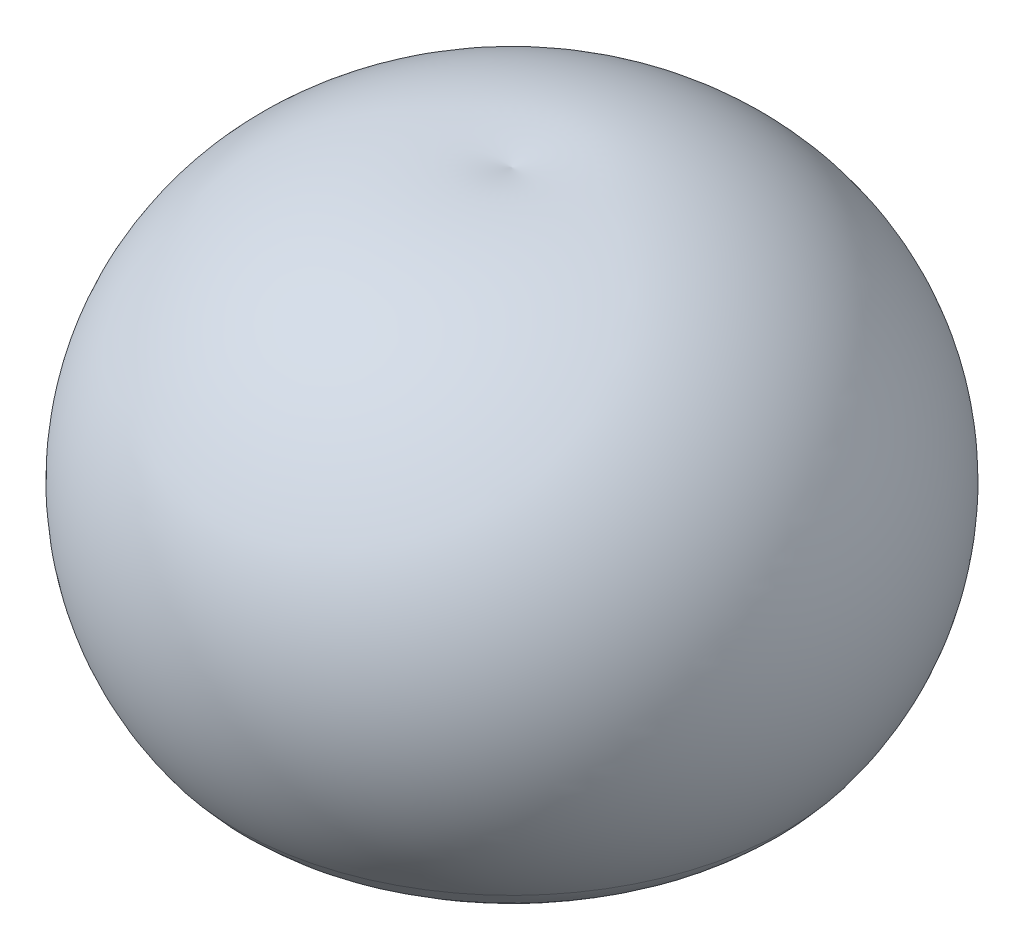
ISO-10303-21;
HEADER;
FILE_DESCRIPTION(('STEP AP214'),'2;1');
FILE_NAME('part.step','',(''),(''),'','','');
FILE_SCHEMA(('AUTOMOTIVE_DESIGN { 1 0 10303 214 1 1 1 1 }'));
ENDSEC;
DATA;
#1=APPLICATION_CONTEXT('core data for automotive mechanical design processes');
#2=APPLICATION_PROTOCOL_DEFINITION('international standard','automotive_design',2000,#1);
#3=PRODUCT_CONTEXT('',#1,'mechanical');
#4=PRODUCT('Part','Part','',(#3));
#5=PRODUCT_RELATED_PRODUCT_CATEGORY('part','',(#4));
#6=PRODUCT_DEFINITION_FORMATION('','',#4);
#7=PRODUCT_DEFINITION_CONTEXT('part definition',#1,'design');
#8=PRODUCT_DEFINITION('design','',#6,#7);
#9=PRODUCT_DEFINITION_SHAPE('','',#8);
#10=(LENGTH_UNIT() NAMED_UNIT(*) SI_UNIT(.MILLI.,.METRE.));
#11=(NAMED_UNIT(*) PLANE_ANGLE_UNIT() SI_UNIT($,.RADIAN.));
#12=(NAMED_UNIT(*) SI_UNIT($,.STERADIAN.) SOLID_ANGLE_UNIT());
#13=UNCERTAINTY_MEASURE_WITH_UNIT(LENGTH_MEASURE(1.E-05),#10,'distance_accuracy_value','');
#14=(GEOMETRIC_REPRESENTATION_CONTEXT(3) GLOBAL_UNCERTAINTY_ASSIGNED_CONTEXT((#13)) GLOBAL_UNIT_ASSIGNED_CONTEXT((#10,
#11,#12)) REPRESENTATION_CONTEXT('',''));
#15=CARTESIAN_POINT('',(0.,0.,0.));
#16=DIRECTION('',(0.,0.,1.));
#17=DIRECTION('',(1.,0.,0.));
#18=AXIS2_PLACEMENT_3D('',#15,#16,#17);
#19=CARTESIAN_POINT('',(-8.88178419700125E-13,284.968023281285,0.));
#20=DIRECTION('',(0.,-1.,0.));
#21=DIRECTION('',(1.,0.,0.));
#22=AXIS2_PLACEMENT_3D('',#19,#20,#21);
#23=TOROIDAL_SURFACE('',#22,817.023390116515,675.906798308761);
#24=CARTESIAN_POINT('',(4.88365186676168E-13,-130.866392805789,0.));
#25=DIRECTION('',(0.,-1.,0.));
#26=DIRECTION('',(1.,0.,0.));
#27=AXIS2_PLACEMENT_3D('',#24,#25,#26);
#28=CIRCLE('',#27,1349.8758447393);
#29=CARTESIAN_POINT('',(1349.8758447393,-130.866392805785,0.));
#30=VERTEX_POINT('',#29);
#31=EDGE_CURVE('E11',#30,#30,#28,.T.);
#32=ORIENTED_EDGE('',*,*,#31,.T.);
#33=EDGE_LOOP('',(#32));
#34=FACE_BOUND('',#33,.T.);
#35=CARTESIAN_POINT('',(-1.41884218355206E-12,425.130379104278,0.));
#36=DIRECTION('',(0.,-1.,0.));
#37=DIRECTION('',(1.,0.,0.));
#38=AXIS2_PLACEMENT_3D('',#35,#36,#37);
#39=CIRCLE('',#38,155.808966491206);
#40=CARTESIAN_POINT('',(155.808966491205,425.130379104278,0.));
#41=VERTEX_POINT('',#40);
#42=EDGE_CURVE('E56',#41,#41,#39,.T.);
#43=ORIENTED_EDGE('',*,*,#42,.F.);
#44=EDGE_LOOP('',(#43));
#45=FACE_BOUND('',#44,.T.);
#46=ADVANCED_FACE('F33',(#34,#45),#23,.T.);
#47=CARTESIAN_POINT('',(260.,675.,0.));
#48=DIRECTION('',(0.,0.,-1.));
#49=DIRECTION('',(1.,0.,0.));
#50=AXIS2_PLACEMENT_3D('',#47,#48,#49);
#51=CIRCLE('',#50,1355.45195414666);
#52=TRIMMED_CURVE('',#51,(PARAMETER_VALUE(-1.76381047491001)),
(PARAMETER_VALUE(1.76381047491001)),.T.,.PARAMETER.);
#53=CARTESIAN_POINT('',(-2.27595720048157E-12,675.,0.));
#54=DIRECTION('',(0.,-1.,0.));
#55=AXIS1_PLACEMENT('',#53,#54);
#56=SURFACE_OF_REVOLUTION('',#52,#55);
#57=CARTESIAN_POINT('',(-6.66133814775094E-12,2005.28192500688,0.));
#58=VERTEX_POINT('',#57);
#59=VERTEX_LOOP('',#58);
#60=FACE_BOUND('',#59,.T.);
#61=ORIENTED_EDGE('',*,*,#31,.F.);
#62=EDGE_LOOP('',(#61));
#63=FACE_BOUND('',#62,.T.);
#64=ADVANCED_FACE('F46',(#60,#63),#56,.T.);
#65=CARTESIAN_POINT('',(-260.000000000005,674.999999999999,0.));
#66=DIRECTION('',(0.,0.,-1.));
#67=DIRECTION('',(1.,0.,0.));
#68=AXIS2_PLACEMENT_3D('',#65,#66,#67);
#69=CIRCLE('',#68,604.677343547969);
#70=TRIMMED_CURVE('',#69,(PARAMETER_VALUE(-1.12632417131784)),
(PARAMETER_VALUE(1.12632417131784)),.T.,.PARAMETER.);
#71=CARTESIAN_POINT('',(-2.27595720048157E-12,675.,0.));
#72=DIRECTION('',(0.,-1.,0.));
#73=AXIS1_PLACEMENT('',#71,#72);
#74=SURFACE_OF_REVOLUTION('',#70,#73);
#75=CARTESIAN_POINT('',(-1.35013696594567E-12,405.101157427161,0.));
#76=DIRECTION('',(0.,-1.,0.));
#77=DIRECTION('',(1.,0.,0.));
#78=AXIS2_PLACEMENT_3D('',#75,#76,#77);
#79=CIRCLE('',#78,281.100087394253);
#80=CARTESIAN_POINT('',(281.100087394252,405.101157427162,0.));
#81=VERTEX_POINT('',#80);
#82=EDGE_CURVE('E40',#81,#81,#79,.T.);
#83=ORIENTED_EDGE('',*,*,#82,.T.);
#84=EDGE_LOOP('',(#83));
#85=FACE_BOUND('',#84,.T.);
#86=CARTESIAN_POINT('',(-4.14861772049206E-12,1220.92553503223,0.));
#87=VERTEX_POINT('',#86);
#88=VERTEX_LOOP('',#87);
#89=FACE_BOUND('',#88,.T.);
#90=ADVANCED_FACE('F49',(#85,#89),#74,.F.);
#91=CARTESIAN_POINT('',(-2.27595720048157E-12,675.,0.));
#92=DIRECTION('',(0.,-1.,0.));
#93=DIRECTION('',(1.,0.,0.));
#94=AXIS2_PLACEMENT_3D('',#91,#92,#93);
#95=DEGENERATE_TOROIDAL_SURFACE('',#94,260.000000000002,270.722364998171,.T.);
#96=ORIENTED_EDGE('',*,*,#42,.T.);
#97=EDGE_LOOP('',(#96));
#98=FACE_BOUND('',#97,.T.);
#99=ORIENTED_EDGE('',*,*,#82,.F.);
#100=EDGE_LOOP('',(#99));
#101=FACE_BOUND('',#100,.T.);
#102=ADVANCED_FACE('F63',(#98,#101),#95,.F.);
#103=CLOSED_SHELL('',(#46,#64,#90,#102));
#104=MANIFOLD_SOLID_BREP('B2',#103);
#105=ADVANCED_BREP_SHAPE_REPRESENTATION('',(#18,#104),#14);
#106=SHAPE_DEFINITION_REPRESENTATION(#9,#105);
ENDSEC;
END-ISO-10303-21;
